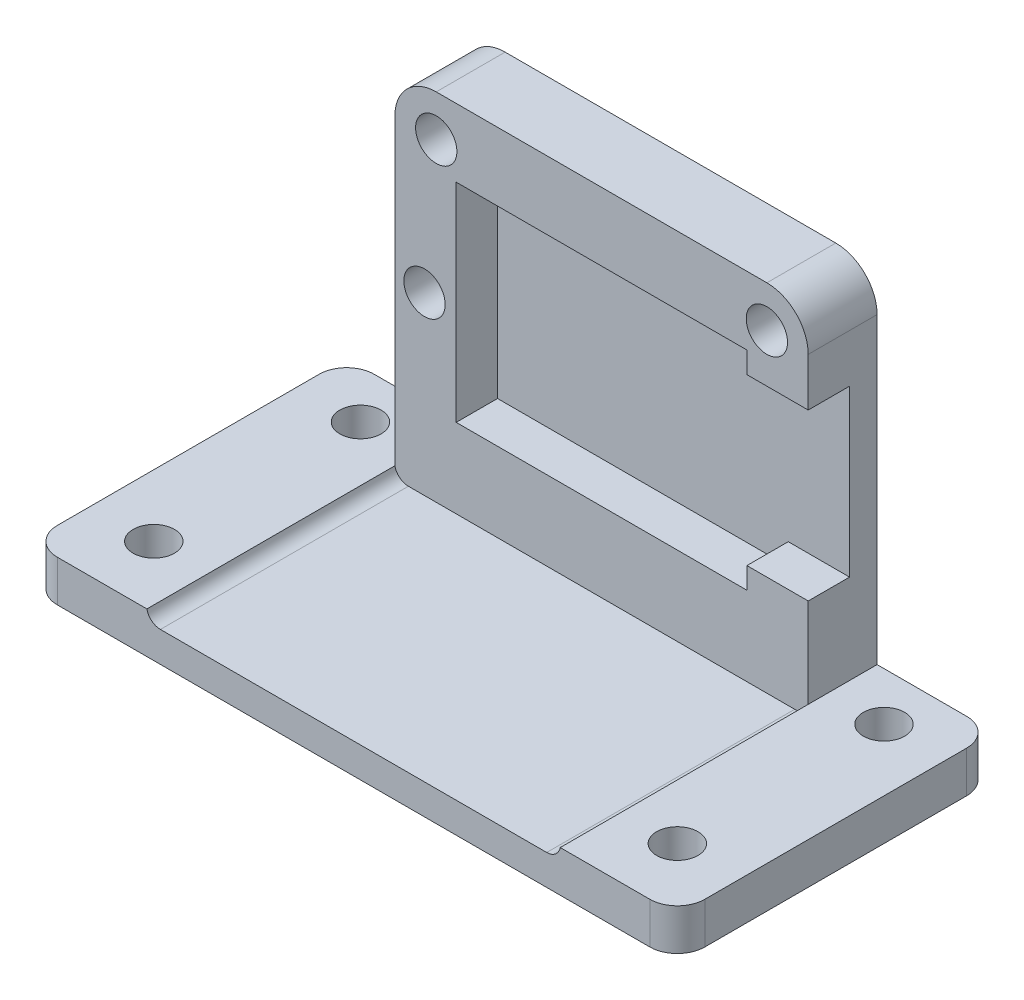
ISO-10303-21;
HEADER;
FILE_DESCRIPTION(('STEP AP214'),'2;1');
FILE_NAME('part.step','',(''),(''),'','','');
FILE_SCHEMA(('AUTOMOTIVE_DESIGN { 1 0 10303 214 1 1 1 1 }'));
ENDSEC;
DATA;
#1=APPLICATION_CONTEXT('core data for automotive mechanical design processes');
#2=APPLICATION_PROTOCOL_DEFINITION('international standard','automotive_design',2000,#1);
#3=PRODUCT_CONTEXT('',#1,'mechanical');
#4=PRODUCT('Part','Part','',(#3));
#5=PRODUCT_RELATED_PRODUCT_CATEGORY('part','',(#4));
#6=PRODUCT_DEFINITION_FORMATION('','',#4);
#7=PRODUCT_DEFINITION_CONTEXT('part definition',#1,'design');
#8=PRODUCT_DEFINITION('design','',#6,#7);
#9=PRODUCT_DEFINITION_SHAPE('','',#8);
#10=(LENGTH_UNIT() NAMED_UNIT(*) SI_UNIT(.MILLI.,.METRE.));
#11=(NAMED_UNIT(*) PLANE_ANGLE_UNIT() SI_UNIT($,.RADIAN.));
#12=(NAMED_UNIT(*) SI_UNIT($,.STERADIAN.) SOLID_ANGLE_UNIT());
#13=UNCERTAINTY_MEASURE_WITH_UNIT(LENGTH_MEASURE(1.E-05),#10,'distance_accuracy_value','');
#14=(GEOMETRIC_REPRESENTATION_CONTEXT(3) GLOBAL_UNCERTAINTY_ASSIGNED_CONTEXT((#13)) GLOBAL_UNIT_ASSIGNED_CONTEXT((#10,
#11,#12)) REPRESENTATION_CONTEXT('',''));
#15=CARTESIAN_POINT('',(0.,0.,0.));
#16=DIRECTION('',(0.,0.,1.));
#17=DIRECTION('',(1.,0.,0.));
#18=AXIS2_PLACEMENT_3D('',#15,#16,#17);
#19=CARTESIAN_POINT('',(0.,-12.5,0.));
#20=DIRECTION('',(0.,1.,0.));
#21=DIRECTION('',(-1.,0.,0.));
#22=AXIS2_PLACEMENT_3D('',#19,#20,#21);
#23=PLANE('',#22);
#24=DIRECTION('',(0.,0.,1.));
#25=VECTOR('',#24,1.);
#26=CARTESIAN_POINT('',(-15.,-12.5,-25.0106647710443));
#27=LINE('',#26,#25);
#28=CARTESIAN_POINT('',(-15.,-12.5,5.));
#29=VERTEX_POINT('',#28);
#30=CARTESIAN_POINT('',(-15.,-12.5,23.));
#31=VERTEX_POINT('',#30);
#32=EDGE_CURVE('E221',#29,#31,#27,.T.);
#33=ORIENTED_EDGE('',*,*,#32,.F.);
#34=DIRECTION('',(0.,0.,-1.));
#35=VECTOR('',#34,1.);
#36=CARTESIAN_POINT('',(-15.,-12.5,5.));
#37=LINE('',#36,#35);
#38=CARTESIAN_POINT('',(-15.,-12.5,0.));
#39=VERTEX_POINT('',#38);
#40=EDGE_CURVE('E327',#29,#39,#37,.T.);
#41=ORIENTED_EDGE('',*,*,#40,.T.);
#42=DIRECTION('',(1.,0.,0.));
#43=VECTOR('',#42,1.);
#44=CARTESIAN_POINT('',(-23.5,-12.5,0.));
#45=LINE('',#44,#43);
#46=CARTESIAN_POINT('',(-21.5,-12.5,0.));
#47=VERTEX_POINT('',#46);
#48=EDGE_CURVE('E584',#47,#39,#45,.T.);
#49=ORIENTED_EDGE('',*,*,#48,.F.);
#50=CARTESIAN_POINT('',(-21.5,-12.5,2.));
#51=DIRECTION('',(0.,1.,0.));
#52=DIRECTION('',(-1.,0.,0.));
#53=AXIS2_PLACEMENT_3D('',#50,#51,#52);
#54=CIRCLE('',#53,2.);
#55=CARTESIAN_POINT('',(-23.5,-12.5,2.));
#56=VERTEX_POINT('',#55);
#57=EDGE_CURVE('E363',#47,#56,#54,.T.);
#58=ORIENTED_EDGE('',*,*,#57,.T.);
#59=DIRECTION('',(0.,0.,-1.));
#60=VECTOR('',#59,1.);
#61=CARTESIAN_POINT('',(-23.5,-12.5,0.));
#62=LINE('',#61,#60);
#63=CARTESIAN_POINT('',(-23.5,-12.5,21.));
#64=VERTEX_POINT('',#63);
#65=EDGE_CURVE('E569',#64,#56,#62,.T.);
#66=ORIENTED_EDGE('',*,*,#65,.F.);
#67=CARTESIAN_POINT('',(-21.5,-12.5,21.));
#68=DIRECTION('',(0.,1.,0.));
#69=DIRECTION('',(-1.,0.,0.));
#70=AXIS2_PLACEMENT_3D('',#67,#68,#69);
#71=CIRCLE('',#70,2.);
#72=CARTESIAN_POINT('',(-21.5,-12.5,23.));
#73=VERTEX_POINT('',#72);
#74=EDGE_CURVE('E360',#64,#73,#71,.T.);
#75=ORIENTED_EDGE('',*,*,#74,.T.);
#76=DIRECTION('',(-1.,0.,0.));
#77=VECTOR('',#76,1.);
#78=CARTESIAN_POINT('',(-23.5,-12.5,23.));
#79=LINE('',#78,#77);
#80=EDGE_CURVE('E230',#31,#73,#79,.T.);
#81=ORIENTED_EDGE('',*,*,#80,.F.);
#82=EDGE_LOOP('',(#33,#41,#49,#58,#66,#75,#81));
#83=FACE_BOUND('',#82,.T.);
#84=CARTESIAN_POINT('',(-19.,-12.5,3.5));
#85=DIRECTION('',(0.,1.,0.));
#86=DIRECTION('',(-1.,0.,0.));
#87=AXIS2_PLACEMENT_3D('',#84,#85,#86);
#88=CIRCLE('',#87,1.5);
#89=CARTESIAN_POINT('',(-20.5,-12.5,3.5));
#90=VERTEX_POINT('',#89);
#91=EDGE_CURVE('E605',#90,#90,#88,.T.);
#92=ORIENTED_EDGE('',*,*,#91,.F.);
#93=EDGE_LOOP('',(#92));
#94=FACE_BOUND('',#93,.T.);
#95=CARTESIAN_POINT('',(-19.,-12.5,18.5));
#96=DIRECTION('',(0.,1.,0.));
#97=DIRECTION('',(-1.,0.,0.));
#98=AXIS2_PLACEMENT_3D('',#95,#96,#97);
#99=CIRCLE('',#98,1.5);
#100=CARTESIAN_POINT('',(-20.5,-12.5,18.5));
#101=VERTEX_POINT('',#100);
#102=EDGE_CURVE('E609',#101,#101,#99,.T.);
#103=ORIENTED_EDGE('',*,*,#102,.F.);
#104=EDGE_LOOP('',(#103));
#105=FACE_BOUND('',#104,.T.);
#106=ADVANCED_FACE('F41',(#83,#94,#105),#23,.T.);
#107=CARTESIAN_POINT('',(10.55,-7.55,2.));
#108=DIRECTION('',(1.,0.,0.));
#109=DIRECTION('',(0.,0.,-1.));
#110=AXIS2_PLACEMENT_3D('',#107,#108,#109);
#111=PLANE('',#110);
#112=DIRECTION('',(0.,1.,0.));
#113=VECTOR('',#112,1.);
#114=CARTESIAN_POINT('',(10.55,-7.55,2.));
#115=LINE('',#114,#113);
#116=CARTESIAN_POINT('',(10.55,6.,2.));
#117=VERTEX_POINT('',#116);
#118=CARTESIAN_POINT('',(10.55,7.55,2.));
#119=VERTEX_POINT('',#118);
#120=EDGE_CURVE('E280',#117,#119,#115,.T.);
#121=ORIENTED_EDGE('',*,*,#120,.F.);
#122=DIRECTION('',(0.,0.,1.));
#123=VECTOR('',#122,1.);
#124=CARTESIAN_POINT('',(10.55,6.,-10.7985350724214));
#125=LINE('',#124,#123);
#126=CARTESIAN_POINT('',(10.55,6.,5.));
#127=VERTEX_POINT('',#126);
#128=EDGE_CURVE('E256',#117,#127,#125,.T.);
#129=ORIENTED_EDGE('',*,*,#128,.T.);
#130=DIRECTION('',(0.,1.,0.));
#131=VECTOR('',#130,1.);
#132=CARTESIAN_POINT('',(10.55,-7.55,5.));
#133=LINE('',#132,#131);
#134=CARTESIAN_POINT('',(10.55,7.55,5.));
#135=VERTEX_POINT('',#134);
#136=EDGE_CURVE('E292',#127,#135,#133,.T.);
#137=ORIENTED_EDGE('',*,*,#136,.T.);
#138=DIRECTION('',(0.,0.,1.));
#139=VECTOR('',#138,1.);
#140=CARTESIAN_POINT('',(10.55,7.55,2.));
#141=LINE('',#140,#139);
#142=EDGE_CURVE('E301',#119,#135,#141,.T.);
#143=ORIENTED_EDGE('',*,*,#142,.F.);
#144=EDGE_LOOP('',(#121,#129,#137,#143));
#145=FACE_BOUND('',#144,.T.);
#146=ADVANCED_FACE('F437',(#145),#111,.F.);
#147=CARTESIAN_POINT('',(-15.,-12.5,5.));
#148=DIRECTION('',(1.,0.,0.));
#149=DIRECTION('',(0.,0.,-1.));
#150=AXIS2_PLACEMENT_3D('',#147,#148,#149);
#151=PLANE('',#150);
#152=DIRECTION('',(0.,-1.,0.));
#153=VECTOR('',#152,1.);
#154=CARTESIAN_POINT('',(-15.,-12.5,5.));
#155=LINE('',#154,#153);
#156=CARTESIAN_POINT('',(-15.,9.50000000000001,5.));
#157=VERTEX_POINT('',#156);
#158=EDGE_CURVE('E308',#157,#29,#155,.T.);
#159=ORIENTED_EDGE('',*,*,#158,.F.);
#160=DIRECTION('',(0.,0.,-1.));
#161=VECTOR('',#160,1.);
#162=CARTESIAN_POINT('',(-15.,9.50000000000001,5.));
#163=LINE('',#162,#161);
#164=CARTESIAN_POINT('',(-15.,9.50000000000001,0.));
#165=VERTEX_POINT('',#164);
#166=EDGE_CURVE('E345',#157,#165,#163,.T.);
#167=ORIENTED_EDGE('',*,*,#166,.T.);
#168=DIRECTION('',(0.,-1.,0.));
#169=VECTOR('',#168,1.);
#170=CARTESIAN_POINT('',(-15.,-12.5,0.));
#171=LINE('',#170,#169);
#172=EDGE_CURVE('E300',#165,#39,#171,.T.);
#173=ORIENTED_EDGE('',*,*,#172,.T.);
#174=ORIENTED_EDGE('',*,*,#40,.F.);
#175=EDGE_LOOP('',(#159,#167,#173,#174));
#176=FACE_BOUND('',#175,.T.);
#177=ADVANCED_FACE('F460',(#176),#151,.F.);
#178=CARTESIAN_POINT('',(15.,-12.5,5.));
#179=DIRECTION('',(-1.,0.,0.));
#180=DIRECTION('',(0.,0.,1.));
#181=AXIS2_PLACEMENT_3D('',#178,#179,#180);
#182=PLANE('',#181);
#183=DIRECTION('',(0.,1.,0.));
#184=VECTOR('',#183,1.);
#185=CARTESIAN_POINT('',(15.,-12.5,0.));
#186=LINE('',#185,#184);
#187=CARTESIAN_POINT('',(15.,-12.5,0.));
#188=VERTEX_POINT('',#187);
#189=CARTESIAN_POINT('',(15.,9.50000000000001,0.));
#190=VERTEX_POINT('',#189);
#191=EDGE_CURVE('E321',#188,#190,#186,.T.);
#192=ORIENTED_EDGE('',*,*,#191,.T.);
#193=DIRECTION('',(0.,0.,-1.));
#194=VECTOR('',#193,1.);
#195=CARTESIAN_POINT('',(15.,9.50000000000001,5.));
#196=LINE('',#195,#194);
#197=CARTESIAN_POINT('',(15.,9.50000000000001,5.));
#198=VERTEX_POINT('',#197);
#199=EDGE_CURVE('E339',#190,#198,#196,.F.);
#200=ORIENTED_EDGE('',*,*,#199,.T.);
#201=DIRECTION('',(0.,1.,0.));
#202=VECTOR('',#201,1.);
#203=CARTESIAN_POINT('',(15.,-12.5,5.));
#204=LINE('',#203,#202);
#205=CARTESIAN_POINT('',(15.,6.,5.));
#206=VERTEX_POINT('',#205);
#207=EDGE_CURVE('E311',#206,#198,#204,.T.);
#208=ORIENTED_EDGE('',*,*,#207,.F.);
#209=DIRECTION('',(0.,0.,1.));
#210=VECTOR('',#209,1.);
#211=CARTESIAN_POINT('',(15.,6.,-10.7985350724214));
#212=LINE('',#211,#210);
#213=CARTESIAN_POINT('',(15.,6.,2.));
#214=VERTEX_POINT('',#213);
#215=EDGE_CURVE('E265',#214,#206,#212,.T.);
#216=ORIENTED_EDGE('',*,*,#215,.F.);
#217=DIRECTION('',(0.,-1.,0.));
#218=VECTOR('',#217,1.);
#219=CARTESIAN_POINT('',(15.,-6.,2.));
#220=LINE('',#219,#218);
#221=CARTESIAN_POINT('',(15.,-6.,2.));
#222=VERTEX_POINT('',#221);
#223=EDGE_CURVE('E252',#214,#222,#220,.T.);
#224=ORIENTED_EDGE('',*,*,#223,.T.);
#225=DIRECTION('',(0.,0.,1.));
#226=VECTOR('',#225,1.);
#227=CARTESIAN_POINT('',(15.,-6.,-10.7985350724214));
#228=LINE('',#227,#226);
#229=CARTESIAN_POINT('',(15.,-6.,5.));
#230=VERTEX_POINT('',#229);
#231=EDGE_CURVE('E267',#222,#230,#228,.T.);
#232=ORIENTED_EDGE('',*,*,#231,.T.);
#233=CARTESIAN_POINT('',(15.,-12.5,5.));
#234=VERTEX_POINT('',#233);
#235=EDGE_CURVE('E313',#234,#230,#204,.T.);
#236=ORIENTED_EDGE('',*,*,#235,.F.);
#237=DIRECTION('',(0.,0.,-1.));
#238=VECTOR('',#237,1.);
#239=CARTESIAN_POINT('',(15.,-12.5,5.));
#240=LINE('',#239,#238);
#241=EDGE_CURVE('E220',#234,#188,#240,.T.);
#242=ORIENTED_EDGE('',*,*,#241,.T.);
#243=EDGE_LOOP('',(#192,#200,#208,#216,#224,#232,#236,#242));
#244=FACE_BOUND('',#243,.T.);
#245=ADVANCED_FACE('F403',(#244),#182,.F.);
#246=CARTESIAN_POINT('',(15.,12.5,5.));
#247=DIRECTION('',(0.,-1.,0.));
#248=DIRECTION('',(1.,0.,0.));
#249=AXIS2_PLACEMENT_3D('',#246,#247,#248);
#250=PLANE('',#249);
#251=DIRECTION('',(-1.,0.,0.));
#252=VECTOR('',#251,1.);
#253=CARTESIAN_POINT('',(15.,12.5,5.));
#254=LINE('',#253,#252);
#255=CARTESIAN_POINT('',(12.,12.5,5.));
#256=VERTEX_POINT('',#255);
#257=CARTESIAN_POINT('',(-12.,12.5,5.));
#258=VERTEX_POINT('',#257);
#259=EDGE_CURVE('E316',#256,#258,#254,.T.);
#260=ORIENTED_EDGE('',*,*,#259,.F.);
#261=DIRECTION('',(0.,0.,-1.));
#262=VECTOR('',#261,1.);
#263=CARTESIAN_POINT('',(12.,12.5,5.));
#264=LINE('',#263,#262);
#265=CARTESIAN_POINT('',(12.,12.5,0.));
#266=VERTEX_POINT('',#265);
#267=EDGE_CURVE('E332',#256,#266,#264,.T.);
#268=ORIENTED_EDGE('',*,*,#267,.T.);
#269=DIRECTION('',(-1.,0.,0.));
#270=VECTOR('',#269,1.);
#271=CARTESIAN_POINT('',(15.,12.5,0.));
#272=LINE('',#271,#270);
#273=CARTESIAN_POINT('',(-12.,12.5,0.));
#274=VERTEX_POINT('',#273);
#275=EDGE_CURVE('E312',#266,#274,#272,.T.);
#276=ORIENTED_EDGE('',*,*,#275,.T.);
#277=DIRECTION('',(0.,0.,-1.));
#278=VECTOR('',#277,1.);
#279=CARTESIAN_POINT('',(-12.,12.5,5.));
#280=LINE('',#279,#278);
#281=EDGE_CURVE('E330',#274,#258,#280,.F.);
#282=ORIENTED_EDGE('',*,*,#281,.T.);
#283=EDGE_LOOP('',(#260,#268,#276,#282));
#284=FACE_BOUND('',#283,.T.);
#285=ADVANCED_FACE('F448',(#284),#250,.F.);
#286=CARTESIAN_POINT('',(0.,0.,5.));
#287=DIRECTION('',(0.,0.,1.));
#288=DIRECTION('',(1.,0.,0.));
#289=AXIS2_PLACEMENT_3D('',#286,#287,#288);
#290=PLANE('',#289);
#291=CARTESIAN_POINT('',(12.,9.50000000000001,5.));
#292=DIRECTION('',(0.,0.,1.));
#293=DIRECTION('',(1.,0.,0.));
#294=AXIS2_PLACEMENT_3D('',#291,#292,#293);
#295=CIRCLE('',#294,1.5);
#296=CARTESIAN_POINT('',(13.5,9.50000000000001,5.));
#297=VERTEX_POINT('',#296);
#298=EDGE_CURVE('E248',#297,#297,#295,.T.);
#299=ORIENTED_EDGE('',*,*,#298,.F.);
#300=EDGE_LOOP('',(#299));
#301=FACE_BOUND('',#300,.T.);
#302=CARTESIAN_POINT('',(-12.,9.50000000000001,5.));
#303=DIRECTION('',(0.,0.,1.));
#304=DIRECTION('',(1.,0.,0.));
#305=AXIS2_PLACEMENT_3D('',#302,#303,#304);
#306=CIRCLE('',#305,1.5);
#307=CARTESIAN_POINT('',(-10.5,9.50000000000001,5.));
#308=VERTEX_POINT('',#307);
#309=EDGE_CURVE('E244',#308,#308,#306,.T.);
#310=ORIENTED_EDGE('',*,*,#309,.F.);
#311=EDGE_LOOP('',(#310));
#312=FACE_BOUND('',#311,.T.);
#313=CARTESIAN_POINT('',(-12.85,-0.550000000000003,5.));
#314=DIRECTION('',(0.,0.,1.));
#315=DIRECTION('',(1.,0.,0.));
#316=AXIS2_PLACEMENT_3D('',#313,#314,#315);
#317=CIRCLE('',#316,1.5);
#318=CARTESIAN_POINT('',(-11.35,-0.550000000000003,5.));
#319=VERTEX_POINT('',#318);
#320=EDGE_CURVE('E239',#319,#319,#317,.T.);
#321=ORIENTED_EDGE('',*,*,#320,.F.);
#322=EDGE_LOOP('',(#321));
#323=FACE_BOUND('',#322,.T.);
#324=DIRECTION('',(-1.,0.,0.));
#325=VECTOR('',#324,1.);
#326=CARTESIAN_POINT('',(-15.,-13.3,5.));
#327=LINE('',#326,#325);
#328=CARTESIAN_POINT('',(14.0202041028867,-13.3,5.));
#329=VERTEX_POINT('',#328);
#330=CARTESIAN_POINT('',(-14.0202041028867,-13.3,5.));
#331=VERTEX_POINT('',#330);
#332=EDGE_CURVE('E401',#329,#331,#327,.T.);
#333=ORIENTED_EDGE('',*,*,#332,.F.);
#334=CARTESIAN_POINT('',(14.0202041028867,-12.3,5.));
#335=DIRECTION('',(0.,0.,1.));
#336=DIRECTION('',(1.,0.,0.));
#337=AXIS2_PLACEMENT_3D('',#334,#335,#336);
#338=CIRCLE('',#337,1.);
#339=EDGE_CURVE('E212',#329,#234,#338,.T.);
#340=ORIENTED_EDGE('',*,*,#339,.T.);
#341=ORIENTED_EDGE('',*,*,#235,.T.);
#342=DIRECTION('',(1.,0.,0.));
#343=VECTOR('',#342,1.);
#344=CARTESIAN_POINT('',(15.,-6.,5.));
#345=LINE('',#344,#343);
#346=CARTESIAN_POINT('',(10.55,-6.,5.));
#347=VERTEX_POINT('',#346);
#348=EDGE_CURVE('E251',#347,#230,#345,.T.);
#349=ORIENTED_EDGE('',*,*,#348,.F.);
#350=CARTESIAN_POINT('',(10.55,-7.55,5.));
#351=VERTEX_POINT('',#350);
#352=EDGE_CURVE('E293',#351,#347,#133,.T.);
#353=ORIENTED_EDGE('',*,*,#352,.F.);
#354=DIRECTION('',(1.,0.,0.));
#355=VECTOR('',#354,1.);
#356=CARTESIAN_POINT('',(10.55,-7.55,5.));
#357=LINE('',#356,#355);
#358=CARTESIAN_POINT('',(-10.55,-7.55,5.));
#359=VERTEX_POINT('',#358);
#360=EDGE_CURVE('E289',#359,#351,#357,.T.);
#361=ORIENTED_EDGE('',*,*,#360,.F.);
#362=DIRECTION('',(0.,-1.,0.));
#363=VECTOR('',#362,1.);
#364=CARTESIAN_POINT('',(-10.55,-7.55,5.));
#365=LINE('',#364,#363);
#366=CARTESIAN_POINT('',(-10.55,7.55,5.));
#367=VERTEX_POINT('',#366);
#368=EDGE_CURVE('E272',#367,#359,#365,.T.);
#369=ORIENTED_EDGE('',*,*,#368,.F.);
#370=DIRECTION('',(-1.,0.,0.));
#371=VECTOR('',#370,1.);
#372=CARTESIAN_POINT('',(10.55,7.55,5.));
#373=LINE('',#372,#371);
#374=EDGE_CURVE('E277',#135,#367,#373,.T.);
#375=ORIENTED_EDGE('',*,*,#374,.F.);
#376=ORIENTED_EDGE('',*,*,#136,.F.);
#377=DIRECTION('',(-1.,0.,0.));
#378=VECTOR('',#377,1.);
#379=CARTESIAN_POINT('',(15.,6.,5.));
#380=LINE('',#379,#378);
#381=EDGE_CURVE('E260',#206,#127,#380,.T.);
#382=ORIENTED_EDGE('',*,*,#381,.F.);
#383=ORIENTED_EDGE('',*,*,#207,.T.);
#384=CARTESIAN_POINT('',(12.,9.50000000000001,5.));
#385=DIRECTION('',(0.,0.,1.));
#386=DIRECTION('',(1.,0.,0.));
#387=AXIS2_PLACEMENT_3D('',#384,#385,#386);
#388=CIRCLE('',#387,3.);
#389=EDGE_CURVE('E343',#198,#256,#388,.T.);
#390=ORIENTED_EDGE('',*,*,#389,.T.);
#391=ORIENTED_EDGE('',*,*,#259,.T.);
#392=CARTESIAN_POINT('',(-12.,9.50000000000001,5.));
#393=DIRECTION('',(0.,0.,1.));
#394=DIRECTION('',(1.,0.,0.));
#395=AXIS2_PLACEMENT_3D('',#392,#393,#394);
#396=CIRCLE('',#395,3.);
#397=EDGE_CURVE('E341',#258,#157,#396,.T.);
#398=ORIENTED_EDGE('',*,*,#397,.T.);
#399=ORIENTED_EDGE('',*,*,#158,.T.);
#400=CARTESIAN_POINT('',(-14.0202041028867,-12.3,5.));
#401=DIRECTION('',(0.,0.,1.));
#402=DIRECTION('',(1.,0.,0.));
#403=AXIS2_PLACEMENT_3D('',#400,#401,#402);
#404=CIRCLE('',#403,1.);
#405=EDGE_CURVE('E393',#29,#331,#404,.T.);
#406=ORIENTED_EDGE('',*,*,#405,.T.);
#407=EDGE_LOOP('',(#333,#340,#341,#349,#353,#361,#369,#375,#376,#382,#383,#390,#391,#398,#399,#406));
#408=FACE_BOUND('',#407,.T.);
#409=ADVANCED_FACE('F398',(#301,#312,#323,#408),#290,.T.);
#410=CARTESIAN_POINT('',(0.,0.,0.));
#411=DIRECTION('',(0.,0.,1.));
#412=DIRECTION('',(1.,0.,0.));
#413=AXIS2_PLACEMENT_3D('',#410,#411,#412);
#414=PLANE('',#413);
#415=CARTESIAN_POINT('',(12.,9.50000000000001,0.));
#416=DIRECTION('',(0.,0.,1.));
#417=DIRECTION('',(1.,0.,0.));
#418=AXIS2_PLACEMENT_3D('',#415,#416,#417);
#419=CIRCLE('',#418,1.5);
#420=CARTESIAN_POINT('',(13.5,9.50000000000001,0.));
#421=VERTEX_POINT('',#420);
#422=EDGE_CURVE('E247',#421,#421,#419,.T.);
#423=ORIENTED_EDGE('',*,*,#422,.T.);
#424=EDGE_LOOP('',(#423));
#425=FACE_BOUND('',#424,.T.);
#426=CARTESIAN_POINT('',(-12.,9.50000000000001,0.));
#427=DIRECTION('',(0.,0.,1.));
#428=DIRECTION('',(1.,0.,0.));
#429=AXIS2_PLACEMENT_3D('',#426,#427,#428);
#430=CIRCLE('',#429,1.5);
#431=CARTESIAN_POINT('',(-10.5,9.50000000000001,0.));
#432=VERTEX_POINT('',#431);
#433=EDGE_CURVE('E242',#432,#432,#430,.T.);
#434=ORIENTED_EDGE('',*,*,#433,.T.);
#435=EDGE_LOOP('',(#434));
#436=FACE_BOUND('',#435,.T.);
#437=CARTESIAN_POINT('',(-12.85,-0.550000000000003,0.));
#438=DIRECTION('',(0.,0.,1.));
#439=DIRECTION('',(1.,0.,0.));
#440=AXIS2_PLACEMENT_3D('',#437,#438,#439);
#441=CIRCLE('',#440,1.5);
#442=CARTESIAN_POINT('',(-11.35,-0.550000000000003,0.));
#443=VERTEX_POINT('',#442);
#444=EDGE_CURVE('E243',#443,#443,#441,.T.);
#445=ORIENTED_EDGE('',*,*,#444,.T.);
#446=EDGE_LOOP('',(#445));
#447=FACE_BOUND('',#446,.T.);
#448=CARTESIAN_POINT('',(21.5,-12.5,0.));
#449=VERTEX_POINT('',#448);
#450=EDGE_CURVE('E582',#188,#449,#45,.T.);
#451=ORIENTED_EDGE('',*,*,#450,.T.);
#452=DIRECTION('',(0.,1.,0.));
#453=VECTOR('',#452,1.);
#454=CARTESIAN_POINT('',(21.5,0.,0.));
#455=LINE('',#454,#453);
#456=CARTESIAN_POINT('',(21.5,-15.5,0.));
#457=VERTEX_POINT('',#456);
#458=EDGE_CURVE('E372',#449,#457,#455,.F.);
#459=ORIENTED_EDGE('',*,*,#458,.T.);
#460=DIRECTION('',(1.,0.,0.));
#461=VECTOR('',#460,1.);
#462=CARTESIAN_POINT('',(-23.5,-15.5,0.));
#463=LINE('',#462,#461);
#464=CARTESIAN_POINT('',(-21.5,-15.5,0.));
#465=VERTEX_POINT('',#464);
#466=EDGE_CURVE('E233',#465,#457,#463,.T.);
#467=ORIENTED_EDGE('',*,*,#466,.F.);
#468=DIRECTION('',(0.,1.,0.));
#469=VECTOR('',#468,1.);
#470=CARTESIAN_POINT('',(-21.5,0.,0.));
#471=LINE('',#470,#469);
#472=EDGE_CURVE('E369',#465,#47,#471,.T.);
#473=ORIENTED_EDGE('',*,*,#472,.T.);
#474=ORIENTED_EDGE('',*,*,#48,.T.);
#475=ORIENTED_EDGE('',*,*,#172,.F.);
#476=CARTESIAN_POINT('',(-12.,9.50000000000001,0.));
#477=DIRECTION('',(0.,0.,1.));
#478=DIRECTION('',(1.,0.,0.));
#479=AXIS2_PLACEMENT_3D('',#476,#477,#478);
#480=CIRCLE('',#479,3.);
#481=EDGE_CURVE('E335',#165,#274,#480,.F.);
#482=ORIENTED_EDGE('',*,*,#481,.T.);
#483=ORIENTED_EDGE('',*,*,#275,.F.);
#484=CARTESIAN_POINT('',(12.,9.50000000000001,0.));
#485=DIRECTION('',(0.,0.,1.));
#486=DIRECTION('',(1.,0.,0.));
#487=AXIS2_PLACEMENT_3D('',#484,#485,#486);
#488=CIRCLE('',#487,3.);
#489=EDGE_CURVE('E337',#266,#190,#488,.F.);
#490=ORIENTED_EDGE('',*,*,#489,.T.);
#491=ORIENTED_EDGE('',*,*,#191,.F.);
#492=EDGE_LOOP('',(#451,#459,#467,#473,#474,#475,#482,#483,#490,#491));
#493=FACE_BOUND('',#492,.T.);
#494=ADVANCED_FACE('F452',(#425,#436,#447,#493),#414,.F.);
#495=CARTESIAN_POINT('',(-10.55,-7.55,2.));
#496=DIRECTION('',(-1.,0.,0.));
#497=DIRECTION('',(0.,0.,1.));
#498=AXIS2_PLACEMENT_3D('',#495,#496,#497);
#499=PLANE('',#498);
#500=ORIENTED_EDGE('',*,*,#368,.T.);
#501=DIRECTION('',(0.,0.,1.));
#502=VECTOR('',#501,1.);
#503=CARTESIAN_POINT('',(-10.55,-7.55,2.));
#504=LINE('',#503,#502);
#505=CARTESIAN_POINT('',(-10.55,-7.55,2.));
#506=VERTEX_POINT('',#505);
#507=EDGE_CURVE('E287',#506,#359,#504,.T.);
#508=ORIENTED_EDGE('',*,*,#507,.F.);
#509=DIRECTION('',(0.,-1.,0.));
#510=VECTOR('',#509,1.);
#511=CARTESIAN_POINT('',(-10.55,-7.55,2.));
#512=LINE('',#511,#510);
#513=CARTESIAN_POINT('',(-10.55,7.55,2.));
#514=VERTEX_POINT('',#513);
#515=EDGE_CURVE('E273',#514,#506,#512,.T.);
#516=ORIENTED_EDGE('',*,*,#515,.F.);
#517=DIRECTION('',(0.,0.,1.));
#518=VECTOR('',#517,1.);
#519=CARTESIAN_POINT('',(-10.55,7.55,2.));
#520=LINE('',#519,#518);
#521=EDGE_CURVE('E298',#514,#367,#520,.T.);
#522=ORIENTED_EDGE('',*,*,#521,.T.);
#523=EDGE_LOOP('',(#500,#508,#516,#522));
#524=FACE_BOUND('',#523,.T.);
#525=ADVANCED_FACE('F426',(#524),#499,.F.);
#526=CARTESIAN_POINT('',(10.55,7.55,2.));
#527=DIRECTION('',(0.,1.,0.));
#528=DIRECTION('',(-1.,0.,0.));
#529=AXIS2_PLACEMENT_3D('',#526,#527,#528);
#530=PLANE('',#529);
#531=ORIENTED_EDGE('',*,*,#374,.T.);
#532=ORIENTED_EDGE('',*,*,#521,.F.);
#533=DIRECTION('',(-1.,0.,0.));
#534=VECTOR('',#533,1.);
#535=CARTESIAN_POINT('',(10.55,7.55,2.));
#536=LINE('',#535,#534);
#537=EDGE_CURVE('E284',#119,#514,#536,.T.);
#538=ORIENTED_EDGE('',*,*,#537,.F.);
#539=ORIENTED_EDGE('',*,*,#142,.T.);
#540=EDGE_LOOP('',(#531,#532,#538,#539));
#541=FACE_BOUND('',#540,.T.);
#542=ADVANCED_FACE('F429',(#541),#530,.F.);
#543=ORIENTED_EDGE('',*,*,#352,.T.);
#544=DIRECTION('',(0.,0.,1.));
#545=VECTOR('',#544,1.);
#546=CARTESIAN_POINT('',(10.55,-6.,-10.7985350724214));
#547=LINE('',#546,#545);
#548=CARTESIAN_POINT('',(10.55,-6.,2.));
#549=VERTEX_POINT('',#548);
#550=EDGE_CURVE('E262',#549,#347,#547,.T.);
#551=ORIENTED_EDGE('',*,*,#550,.F.);
#552=CARTESIAN_POINT('',(10.55,-7.55,2.));
#553=VERTEX_POINT('',#552);
#554=EDGE_CURVE('E281',#553,#549,#115,.T.);
#555=ORIENTED_EDGE('',*,*,#554,.F.);
#556=DIRECTION('',(0.,0.,1.));
#557=VECTOR('',#556,1.);
#558=CARTESIAN_POINT('',(10.55,-7.55,2.));
#559=LINE('',#558,#557);
#560=EDGE_CURVE('E304',#553,#351,#559,.T.);
#561=ORIENTED_EDGE('',*,*,#560,.T.);
#562=EDGE_LOOP('',(#543,#551,#555,#561));
#563=FACE_BOUND('',#562,.T.);
#564=ADVANCED_FACE('F417',(#563),#111,.F.);
#565=CARTESIAN_POINT('',(10.55,-7.55,2.));
#566=DIRECTION('',(0.,-1.,0.));
#567=DIRECTION('',(1.,0.,0.));
#568=AXIS2_PLACEMENT_3D('',#565,#566,#567);
#569=PLANE('',#568);
#570=ORIENTED_EDGE('',*,*,#360,.T.);
#571=ORIENTED_EDGE('',*,*,#560,.F.);
#572=DIRECTION('',(1.,0.,0.));
#573=VECTOR('',#572,1.);
#574=CARTESIAN_POINT('',(10.55,-7.55,2.));
#575=LINE('',#574,#573);
#576=EDGE_CURVE('E276',#506,#553,#575,.T.);
#577=ORIENTED_EDGE('',*,*,#576,.F.);
#578=ORIENTED_EDGE('',*,*,#507,.T.);
#579=EDGE_LOOP('',(#570,#571,#577,#578));
#580=FACE_BOUND('',#579,.T.);
#581=ADVANCED_FACE('F423',(#580),#569,.F.);
#582=CARTESIAN_POINT('',(0.,0.,2.));
#583=DIRECTION('',(0.,0.,1.));
#584=DIRECTION('',(1.,0.,0.));
#585=AXIS2_PLACEMENT_3D('',#582,#583,#584);
#586=PLANE('',#585);
#587=ORIENTED_EDGE('',*,*,#515,.T.);
#588=ORIENTED_EDGE('',*,*,#576,.T.);
#589=ORIENTED_EDGE('',*,*,#554,.T.);
#590=DIRECTION('',(-1.,0.,0.));
#591=VECTOR('',#590,1.);
#592=CARTESIAN_POINT('',(15.,-6.,2.));
#593=LINE('',#592,#591);
#594=EDGE_CURVE('E258',#222,#549,#593,.T.);
#595=ORIENTED_EDGE('',*,*,#594,.F.);
#596=ORIENTED_EDGE('',*,*,#223,.F.);
#597=DIRECTION('',(1.,0.,0.));
#598=VECTOR('',#597,1.);
#599=CARTESIAN_POINT('',(15.,6.,2.));
#600=LINE('',#599,#598);
#601=EDGE_CURVE('E255',#117,#214,#600,.T.);
#602=ORIENTED_EDGE('',*,*,#601,.F.);
#603=ORIENTED_EDGE('',*,*,#120,.T.);
#604=ORIENTED_EDGE('',*,*,#537,.T.);
#605=EDGE_LOOP('',(#587,#588,#589,#595,#596,#602,#603,#604));
#606=FACE_BOUND('',#605,.T.);
#607=ADVANCED_FACE('F412',(#606),#586,.T.);
#608=CARTESIAN_POINT('',(15.,6.,-10.7985350724214));
#609=DIRECTION('',(0.,1.,0.));
#610=DIRECTION('',(-1.,0.,0.));
#611=AXIS2_PLACEMENT_3D('',#608,#609,#610);
#612=PLANE('',#611);
#613=ORIENTED_EDGE('',*,*,#601,.T.);
#614=ORIENTED_EDGE('',*,*,#215,.T.);
#615=ORIENTED_EDGE('',*,*,#381,.T.);
#616=ORIENTED_EDGE('',*,*,#128,.F.);
#617=EDGE_LOOP('',(#613,#614,#615,#616));
#618=FACE_BOUND('',#617,.T.);
#619=ADVANCED_FACE('F439',(#618),#612,.F.);
#620=CARTESIAN_POINT('',(15.,-6.,-10.7985350724214));
#621=DIRECTION('',(0.,-1.,0.));
#622=DIRECTION('',(1.,0.,0.));
#623=AXIS2_PLACEMENT_3D('',#620,#621,#622);
#624=PLANE('',#623);
#625=ORIENTED_EDGE('',*,*,#594,.T.);
#626=ORIENTED_EDGE('',*,*,#550,.T.);
#627=ORIENTED_EDGE('',*,*,#348,.T.);
#628=ORIENTED_EDGE('',*,*,#231,.F.);
#629=EDGE_LOOP('',(#625,#626,#627,#628));
#630=FACE_BOUND('',#629,.T.);
#631=ADVANCED_FACE('F409',(#630),#624,.F.);
#632=CARTESIAN_POINT('',(12.,9.50000000000001,5.));
#633=DIRECTION('',(0.,0.,-1.));
#634=DIRECTION('',(-1.,0.,0.));
#635=AXIS2_PLACEMENT_3D('',#632,#633,#634);
#636=CYLINDRICAL_SURFACE('',#635,3.);
#637=ORIENTED_EDGE('',*,*,#389,.F.);
#638=ORIENTED_EDGE('',*,*,#199,.F.);
#639=ORIENTED_EDGE('',*,*,#489,.F.);
#640=ORIENTED_EDGE('',*,*,#267,.F.);
#641=EDGE_LOOP('',(#637,#638,#639,#640));
#642=FACE_BOUND('',#641,.T.);
#643=ADVANCED_FACE('F445',(#642),#636,.T.);
#644=CARTESIAN_POINT('',(-12.,9.50000000000001,5.));
#645=DIRECTION('',(0.,0.,-1.));
#646=DIRECTION('',(-1.,0.,0.));
#647=AXIS2_PLACEMENT_3D('',#644,#645,#646);
#648=CYLINDRICAL_SURFACE('',#647,3.);
#649=ORIENTED_EDGE('',*,*,#397,.F.);
#650=ORIENTED_EDGE('',*,*,#281,.F.);
#651=ORIENTED_EDGE('',*,*,#481,.F.);
#652=ORIENTED_EDGE('',*,*,#166,.F.);
#653=EDGE_LOOP('',(#649,#650,#651,#652));
#654=FACE_BOUND('',#653,.T.);
#655=ADVANCED_FACE('F457',(#654),#648,.T.);
#656=CARTESIAN_POINT('',(-12.85,-0.550000000000003,-8.));
#657=DIRECTION('',(0.,0.,1.));
#658=DIRECTION('',(1.,0.,0.));
#659=AXIS2_PLACEMENT_3D('',#656,#657,#658);
#660=CYLINDRICAL_SURFACE('',#659,1.5);
#661=ORIENTED_EDGE('',*,*,#320,.T.);
#662=EDGE_LOOP('',(#661));
#663=FACE_BOUND('',#662,.T.);
#664=ORIENTED_EDGE('',*,*,#444,.F.);
#665=EDGE_LOOP('',(#664));
#666=FACE_BOUND('',#665,.T.);
#667=ADVANCED_FACE('F502',(#663,#666),#660,.F.);
#668=CARTESIAN_POINT('',(-12.,9.50000000000001,-8.));
#669=DIRECTION('',(0.,0.,1.));
#670=DIRECTION('',(1.,0.,0.));
#671=AXIS2_PLACEMENT_3D('',#668,#669,#670);
#672=CYLINDRICAL_SURFACE('',#671,1.5);
#673=ORIENTED_EDGE('',*,*,#309,.T.);
#674=EDGE_LOOP('',(#673));
#675=FACE_BOUND('',#674,.T.);
#676=ORIENTED_EDGE('',*,*,#433,.F.);
#677=EDGE_LOOP('',(#676));
#678=FACE_BOUND('',#677,.T.);
#679=ADVANCED_FACE('F495',(#675,#678),#672,.F.);
#680=CARTESIAN_POINT('',(12.,9.50000000000001,-8.));
#681=DIRECTION('',(0.,0.,1.));
#682=DIRECTION('',(1.,0.,0.));
#683=AXIS2_PLACEMENT_3D('',#680,#681,#682);
#684=CYLINDRICAL_SURFACE('',#683,1.5);
#685=ORIENTED_EDGE('',*,*,#298,.T.);
#686=EDGE_LOOP('',(#685));
#687=FACE_BOUND('',#686,.T.);
#688=ORIENTED_EDGE('',*,*,#422,.F.);
#689=EDGE_LOOP('',(#688));
#690=FACE_BOUND('',#689,.T.);
#691=ADVANCED_FACE('F485',(#687,#690),#684,.F.);
#692=DIRECTION('',(0.,0.,1.));
#693=VECTOR('',#692,1.);
#694=CARTESIAN_POINT('',(15.,-12.5,-25.0106647710443));
#695=LINE('',#694,#693);
#696=CARTESIAN_POINT('',(15.,-12.5,23.));
#697=VERTEX_POINT('',#696);
#698=EDGE_CURVE('E210',#234,#697,#695,.T.);
#699=ORIENTED_EDGE('',*,*,#698,.T.);
#700=CARTESIAN_POINT('',(21.5,-12.5,23.));
#701=VERTEX_POINT('',#700);
#702=EDGE_CURVE('E218',#701,#697,#79,.T.);
#703=ORIENTED_EDGE('',*,*,#702,.F.);
#704=CARTESIAN_POINT('',(21.5,-12.5,21.));
#705=DIRECTION('',(0.,1.,0.));
#706=DIRECTION('',(-1.,0.,0.));
#707=AXIS2_PLACEMENT_3D('',#704,#705,#706);
#708=CIRCLE('',#707,2.);
#709=CARTESIAN_POINT('',(23.5,-12.5,21.));
#710=VERTEX_POINT('',#709);
#711=EDGE_CURVE('E365',#701,#710,#708,.T.);
#712=ORIENTED_EDGE('',*,*,#711,.T.);
#713=DIRECTION('',(0.,0.,1.));
#714=VECTOR('',#713,1.);
#715=CARTESIAN_POINT('',(23.5,-12.5,0.));
#716=LINE('',#715,#714);
#717=CARTESIAN_POINT('',(23.5,-12.5,2.));
#718=VERTEX_POINT('',#717);
#719=EDGE_CURVE('E235',#718,#710,#716,.T.);
#720=ORIENTED_EDGE('',*,*,#719,.F.);
#721=CARTESIAN_POINT('',(21.5,-12.5,2.));
#722=DIRECTION('',(0.,1.,0.));
#723=DIRECTION('',(-1.,0.,0.));
#724=AXIS2_PLACEMENT_3D('',#721,#722,#723);
#725=CIRCLE('',#724,2.);
#726=EDGE_CURVE('E367',#718,#449,#725,.T.);
#727=ORIENTED_EDGE('',*,*,#726,.T.);
#728=ORIENTED_EDGE('',*,*,#450,.F.);
#729=ORIENTED_EDGE('',*,*,#241,.F.);
#730=EDGE_LOOP('',(#699,#703,#712,#720,#727,#728,#729));
#731=FACE_BOUND('',#730,.T.);
#732=CARTESIAN_POINT('',(19.,-12.5,3.5));
#733=DIRECTION('',(0.,1.,0.));
#734=DIRECTION('',(-1.,0.,0.));
#735=AXIS2_PLACEMENT_3D('',#732,#733,#734);
#736=CIRCLE('',#735,1.5);
#737=CARTESIAN_POINT('',(17.5,-12.5,3.5));
#738=VERTEX_POINT('',#737);
#739=EDGE_CURVE('E602',#738,#738,#736,.T.);
#740=ORIENTED_EDGE('',*,*,#739,.F.);
#741=EDGE_LOOP('',(#740));
#742=FACE_BOUND('',#741,.T.);
#743=CARTESIAN_POINT('',(19.,-12.5,18.5));
#744=DIRECTION('',(0.,1.,0.));
#745=DIRECTION('',(-1.,0.,0.));
#746=AXIS2_PLACEMENT_3D('',#743,#744,#745);
#747=CIRCLE('',#746,1.5);
#748=CARTESIAN_POINT('',(17.5,-12.5,18.5));
#749=VERTEX_POINT('',#748);
#750=EDGE_CURVE('E596',#749,#749,#747,.T.);
#751=ORIENTED_EDGE('',*,*,#750,.F.);
#752=EDGE_LOOP('',(#751));
#753=FACE_BOUND('',#752,.T.);
#754=ADVANCED_FACE('F216',(#731,#742,#753),#23,.T.);
#755=CARTESIAN_POINT('',(-23.5,-15.5,0.));
#756=DIRECTION('',(1.,0.,0.));
#757=DIRECTION('',(0.,1.,0.));
#758=AXIS2_PLACEMENT_3D('',#755,#756,#757);
#759=PLANE('',#758);
#760=ORIENTED_EDGE('',*,*,#65,.T.);
#761=DIRECTION('',(0.,1.,0.));
#762=VECTOR('',#761,1.);
#763=CARTESIAN_POINT('',(-23.5,-15.5,2.));
#764=LINE('',#763,#762);
#765=CARTESIAN_POINT('',(-23.5,-15.5,2.));
#766=VERTEX_POINT('',#765);
#767=EDGE_CURVE('E388',#56,#766,#764,.F.);
#768=ORIENTED_EDGE('',*,*,#767,.T.);
#769=DIRECTION('',(0.,0.,-1.));
#770=VECTOR('',#769,1.);
#771=CARTESIAN_POINT('',(-23.5,-15.5,0.));
#772=LINE('',#771,#770);
#773=CARTESIAN_POINT('',(-23.5,-15.5,21.));
#774=VERTEX_POINT('',#773);
#775=EDGE_CURVE('E229',#774,#766,#772,.T.);
#776=ORIENTED_EDGE('',*,*,#775,.F.);
#777=DIRECTION('',(0.,1.,0.));
#778=VECTOR('',#777,1.);
#779=CARTESIAN_POINT('',(-23.5,-15.5,21.));
#780=LINE('',#779,#778);
#781=EDGE_CURVE('E385',#774,#64,#780,.T.);
#782=ORIENTED_EDGE('',*,*,#781,.T.);
#783=EDGE_LOOP('',(#760,#768,#776,#782));
#784=FACE_BOUND('',#783,.T.);
#785=ADVANCED_FACE('F484',(#784),#759,.F.);
#786=CARTESIAN_POINT('',(23.5,-15.5,0.));
#787=DIRECTION('',(-1.,0.,0.));
#788=DIRECTION('',(0.,-1.,0.));
#789=AXIS2_PLACEMENT_3D('',#786,#787,#788);
#790=PLANE('',#789);
#791=DIRECTION('',(0.,0.,1.));
#792=VECTOR('',#791,1.);
#793=CARTESIAN_POINT('',(23.5,-15.5,0.));
#794=LINE('',#793,#792);
#795=CARTESIAN_POINT('',(23.5,-15.5,2.));
#796=VERTEX_POINT('',#795);
#797=CARTESIAN_POINT('',(23.5,-15.5,21.));
#798=VERTEX_POINT('',#797);
#799=EDGE_CURVE('E575',#796,#798,#794,.T.);
#800=ORIENTED_EDGE('',*,*,#799,.F.);
#801=DIRECTION('',(0.,1.,0.));
#802=VECTOR('',#801,1.);
#803=CARTESIAN_POINT('',(23.5,-15.5,2.));
#804=LINE('',#803,#802);
#805=EDGE_CURVE('E357',#796,#718,#804,.T.);
#806=ORIENTED_EDGE('',*,*,#805,.T.);
#807=ORIENTED_EDGE('',*,*,#719,.T.);
#808=DIRECTION('',(0.,1.,0.));
#809=VECTOR('',#808,1.);
#810=CARTESIAN_POINT('',(23.5,-15.5,21.));
#811=LINE('',#810,#809);
#812=EDGE_CURVE('E348',#710,#798,#811,.F.);
#813=ORIENTED_EDGE('',*,*,#812,.T.);
#814=EDGE_LOOP('',(#800,#806,#807,#813));
#815=FACE_BOUND('',#814,.T.);
#816=ADVANCED_FACE('F491',(#815),#790,.F.);
#817=CARTESIAN_POINT('',(-23.5,-15.5,23.));
#818=DIRECTION('',(0.,0.,-1.));
#819=DIRECTION('',(-1.,0.,0.));
#820=AXIS2_PLACEMENT_3D('',#817,#818,#819);
#821=PLANE('',#820);
#822=DIRECTION('',(1.,0.,0.));
#823=VECTOR('',#822,1.);
#824=CARTESIAN_POINT('',(-15.,-13.3,23.));
#825=LINE('',#824,#823);
#826=CARTESIAN_POINT('',(-14.0202041028867,-13.3,23.));
#827=VERTEX_POINT('',#826);
#828=CARTESIAN_POINT('',(14.0202041028867,-13.3,23.));
#829=VERTEX_POINT('',#828);
#830=EDGE_CURVE('E222',#827,#829,#825,.T.);
#831=ORIENTED_EDGE('',*,*,#830,.F.);
#832=CARTESIAN_POINT('',(-14.0202041028867,-12.3,23.));
#833=DIRECTION('',(0.,0.,-1.));
#834=DIRECTION('',(-1.,0.,0.));
#835=AXIS2_PLACEMENT_3D('',#832,#833,#834);
#836=CIRCLE('',#835,1.);
#837=EDGE_CURVE('E11',#827,#31,#836,.T.);
#838=ORIENTED_EDGE('',*,*,#837,.T.);
#839=ORIENTED_EDGE('',*,*,#80,.T.);
#840=DIRECTION('',(0.,1.,0.));
#841=VECTOR('',#840,1.);
#842=CARTESIAN_POINT('',(-21.5,-15.5,23.));
#843=LINE('',#842,#841);
#844=CARTESIAN_POINT('',(-21.5,-15.5,23.));
#845=VERTEX_POINT('',#844);
#846=EDGE_CURVE('E382',#73,#845,#843,.F.);
#847=ORIENTED_EDGE('',*,*,#846,.T.);
#848=DIRECTION('',(-1.,0.,0.));
#849=VECTOR('',#848,1.);
#850=CARTESIAN_POINT('',(-23.5,-15.5,23.));
#851=LINE('',#850,#849);
#852=CARTESIAN_POINT('',(21.5,-15.5,23.));
#853=VERTEX_POINT('',#852);
#854=EDGE_CURVE('E351',#853,#845,#851,.T.);
#855=ORIENTED_EDGE('',*,*,#854,.F.);
#856=DIRECTION('',(0.,1.,0.));
#857=VECTOR('',#856,1.);
#858=CARTESIAN_POINT('',(21.5,-15.5,23.));
#859=LINE('',#858,#857);
#860=EDGE_CURVE('E228',#853,#701,#859,.T.);
#861=ORIENTED_EDGE('',*,*,#860,.T.);
#862=ORIENTED_EDGE('',*,*,#702,.T.);
#863=CARTESIAN_POINT('',(14.0202041028867,-12.3,23.));
#864=DIRECTION('',(0.,0.,-1.));
#865=DIRECTION('',(-1.,0.,0.));
#866=AXIS2_PLACEMENT_3D('',#863,#864,#865);
#867=CIRCLE('',#866,1.);
#868=EDGE_CURVE('E49',#697,#829,#867,.T.);
#869=ORIENTED_EDGE('',*,*,#868,.T.);
#870=EDGE_LOOP('',(#831,#838,#839,#847,#855,#861,#862,#869));
#871=FACE_BOUND('',#870,.T.);
#872=ADVANCED_FACE('F225',(#871),#821,.F.);
#873=CARTESIAN_POINT('',(0.,-15.5,0.));
#874=DIRECTION('',(0.,1.,0.));
#875=DIRECTION('',(-1.,0.,0.));
#876=AXIS2_PLACEMENT_3D('',#873,#874,#875);
#877=PLANE('',#876);
#878=CARTESIAN_POINT('',(19.,-15.5,3.5));
#879=DIRECTION('',(0.,1.,0.));
#880=DIRECTION('',(-1.,0.,0.));
#881=AXIS2_PLACEMENT_3D('',#878,#879,#880);
#882=CIRCLE('',#881,1.5);
#883=CARTESIAN_POINT('',(17.5,-15.5,3.5));
#884=VERTEX_POINT('',#883);
#885=EDGE_CURVE('E606',#884,#884,#882,.T.);
#886=ORIENTED_EDGE('',*,*,#885,.T.);
#887=EDGE_LOOP('',(#886));
#888=FACE_BOUND('',#887,.T.);
#889=CARTESIAN_POINT('',(-19.,-15.5,18.5));
#890=DIRECTION('',(0.,1.,0.));
#891=DIRECTION('',(-1.,0.,0.));
#892=AXIS2_PLACEMENT_3D('',#889,#890,#891);
#893=CIRCLE('',#892,1.5);
#894=CARTESIAN_POINT('',(-20.5,-15.5,18.5));
#895=VERTEX_POINT('',#894);
#896=EDGE_CURVE('E599',#895,#895,#893,.T.);
#897=ORIENTED_EDGE('',*,*,#896,.T.);
#898=EDGE_LOOP('',(#897));
#899=FACE_BOUND('',#898,.T.);
#900=CARTESIAN_POINT('',(19.,-15.5,18.5));
#901=DIRECTION('',(0.,1.,0.));
#902=DIRECTION('',(-1.,0.,0.));
#903=AXIS2_PLACEMENT_3D('',#900,#901,#902);
#904=CIRCLE('',#903,1.5);
#905=CARTESIAN_POINT('',(17.5,-15.5,18.5));
#906=VERTEX_POINT('',#905);
#907=EDGE_CURVE('E465',#906,#906,#904,.T.);
#908=ORIENTED_EDGE('',*,*,#907,.T.);
#909=EDGE_LOOP('',(#908));
#910=FACE_BOUND('',#909,.T.);
#911=CARTESIAN_POINT('',(-19.,-15.5,3.5));
#912=DIRECTION('',(0.,1.,0.));
#913=DIRECTION('',(-1.,0.,0.));
#914=AXIS2_PLACEMENT_3D('',#911,#912,#913);
#915=CIRCLE('',#914,1.5);
#916=CARTESIAN_POINT('',(-20.5,-15.5,3.5));
#917=VERTEX_POINT('',#916);
#918=EDGE_CURVE('E583',#917,#917,#915,.T.);
#919=ORIENTED_EDGE('',*,*,#918,.T.);
#920=EDGE_LOOP('',(#919));
#921=FACE_BOUND('',#920,.T.);
#922=ORIENTED_EDGE('',*,*,#466,.T.);
#923=CARTESIAN_POINT('',(21.5,-15.5,2.));
#924=DIRECTION('',(0.,1.,0.));
#925=DIRECTION('',(-1.,0.,0.));
#926=AXIS2_PLACEMENT_3D('',#923,#924,#925);
#927=CIRCLE('',#926,2.);
#928=EDGE_CURVE('E380',#457,#796,#927,.F.);
#929=ORIENTED_EDGE('',*,*,#928,.T.);
#930=ORIENTED_EDGE('',*,*,#799,.T.);
#931=CARTESIAN_POINT('',(21.5,-15.5,21.));
#932=DIRECTION('',(0.,1.,0.));
#933=DIRECTION('',(-1.,0.,0.));
#934=AXIS2_PLACEMENT_3D('',#931,#932,#933);
#935=CIRCLE('',#934,2.);
#936=EDGE_CURVE('E378',#798,#853,#935,.F.);
#937=ORIENTED_EDGE('',*,*,#936,.T.);
#938=ORIENTED_EDGE('',*,*,#854,.T.);
#939=CARTESIAN_POINT('',(-21.5,-15.5,21.));
#940=DIRECTION('',(0.,1.,0.));
#941=DIRECTION('',(-1.,0.,0.));
#942=AXIS2_PLACEMENT_3D('',#939,#940,#941);
#943=CIRCLE('',#942,2.);
#944=EDGE_CURVE('E374',#845,#774,#943,.F.);
#945=ORIENTED_EDGE('',*,*,#944,.T.);
#946=ORIENTED_EDGE('',*,*,#775,.T.);
#947=CARTESIAN_POINT('',(-21.5,-15.5,2.));
#948=DIRECTION('',(0.,1.,0.));
#949=DIRECTION('',(-1.,0.,0.));
#950=AXIS2_PLACEMENT_3D('',#947,#948,#949);
#951=CIRCLE('',#950,2.);
#952=EDGE_CURVE('E376',#766,#465,#951,.F.);
#953=ORIENTED_EDGE('',*,*,#952,.T.);
#954=EDGE_LOOP('',(#922,#929,#930,#937,#938,#945,#946,#953));
#955=FACE_BOUND('',#954,.T.);
#956=ADVANCED_FACE('F564',(#888,#899,#910,#921,#955),#877,.F.);
#957=CARTESIAN_POINT('',(-19.,-15.5,3.5));
#958=DIRECTION('',(0.,1.,0.));
#959=DIRECTION('',(-1.,0.,0.));
#960=AXIS2_PLACEMENT_3D('',#957,#958,#959);
#961=CYLINDRICAL_SURFACE('',#960,1.5);
#962=ORIENTED_EDGE('',*,*,#918,.F.);
#963=EDGE_LOOP('',(#962));
#964=FACE_BOUND('',#963,.T.);
#965=ORIENTED_EDGE('',*,*,#91,.T.);
#966=EDGE_LOOP('',(#965));
#967=FACE_BOUND('',#966,.T.);
#968=ADVANCED_FACE('F618',(#964,#967),#961,.F.);
#969=CARTESIAN_POINT('',(19.,-15.5,18.5));
#970=DIRECTION('',(0.,1.,0.));
#971=DIRECTION('',(-1.,0.,0.));
#972=AXIS2_PLACEMENT_3D('',#969,#970,#971);
#973=CYLINDRICAL_SURFACE('',#972,1.5);
#974=ORIENTED_EDGE('',*,*,#907,.F.);
#975=EDGE_LOOP('',(#974));
#976=FACE_BOUND('',#975,.T.);
#977=ORIENTED_EDGE('',*,*,#750,.T.);
#978=EDGE_LOOP('',(#977));
#979=FACE_BOUND('',#978,.T.);
#980=ADVANCED_FACE('F624',(#976,#979),#973,.F.);
#981=CARTESIAN_POINT('',(-19.,-15.5,18.5));
#982=DIRECTION('',(0.,1.,0.));
#983=DIRECTION('',(-1.,0.,0.));
#984=AXIS2_PLACEMENT_3D('',#981,#982,#983);
#985=CYLINDRICAL_SURFACE('',#984,1.5);
#986=ORIENTED_EDGE('',*,*,#896,.F.);
#987=EDGE_LOOP('',(#986));
#988=FACE_BOUND('',#987,.T.);
#989=ORIENTED_EDGE('',*,*,#102,.T.);
#990=EDGE_LOOP('',(#989));
#991=FACE_BOUND('',#990,.T.);
#992=ADVANCED_FACE('F622',(#988,#991),#985,.F.);
#993=CARTESIAN_POINT('',(19.,-15.5,3.5));
#994=DIRECTION('',(0.,1.,0.));
#995=DIRECTION('',(-1.,0.,0.));
#996=AXIS2_PLACEMENT_3D('',#993,#994,#995);
#997=CYLINDRICAL_SURFACE('',#996,1.5);
#998=ORIENTED_EDGE('',*,*,#885,.F.);
#999=EDGE_LOOP('',(#998));
#1000=FACE_BOUND('',#999,.T.);
#1001=ORIENTED_EDGE('',*,*,#739,.T.);
#1002=EDGE_LOOP('',(#1001));
#1003=FACE_BOUND('',#1002,.T.);
#1004=ADVANCED_FACE('F542',(#1000,#1003),#997,.F.);
#1005=CARTESIAN_POINT('',(21.5,-15.5,2.));
#1006=DIRECTION('',(0.,1.,0.));
#1007=DIRECTION('',(-1.,0.,0.));
#1008=AXIS2_PLACEMENT_3D('',#1005,#1006,#1007);
#1009=CYLINDRICAL_SURFACE('',#1008,2.);
#1010=ORIENTED_EDGE('',*,*,#928,.F.);
#1011=ORIENTED_EDGE('',*,*,#458,.F.);
#1012=ORIENTED_EDGE('',*,*,#726,.F.);
#1013=ORIENTED_EDGE('',*,*,#805,.F.);
#1014=EDGE_LOOP('',(#1010,#1011,#1012,#1013));
#1015=FACE_BOUND('',#1014,.T.);
#1016=ADVANCED_FACE('F538',(#1015),#1009,.T.);
#1017=CARTESIAN_POINT('',(21.5,-15.5,21.));
#1018=DIRECTION('',(0.,1.,0.));
#1019=DIRECTION('',(-1.,0.,0.));
#1020=AXIS2_PLACEMENT_3D('',#1017,#1018,#1019);
#1021=CYLINDRICAL_SURFACE('',#1020,2.);
#1022=ORIENTED_EDGE('',*,*,#936,.F.);
#1023=ORIENTED_EDGE('',*,*,#812,.F.);
#1024=ORIENTED_EDGE('',*,*,#711,.F.);
#1025=ORIENTED_EDGE('',*,*,#860,.F.);
#1026=EDGE_LOOP('',(#1022,#1023,#1024,#1025));
#1027=FACE_BOUND('',#1026,.T.);
#1028=ADVANCED_FACE('F541',(#1027),#1021,.T.);
#1029=CARTESIAN_POINT('',(-21.5,0.,2.));
#1030=DIRECTION('',(0.,1.,0.));
#1031=DIRECTION('',(-1.,0.,0.));
#1032=AXIS2_PLACEMENT_3D('',#1029,#1030,#1031);
#1033=CYLINDRICAL_SURFACE('',#1032,2.);
#1034=ORIENTED_EDGE('',*,*,#952,.F.);
#1035=ORIENTED_EDGE('',*,*,#767,.F.);
#1036=ORIENTED_EDGE('',*,*,#57,.F.);
#1037=ORIENTED_EDGE('',*,*,#472,.F.);
#1038=EDGE_LOOP('',(#1034,#1035,#1036,#1037));
#1039=FACE_BOUND('',#1038,.T.);
#1040=ADVANCED_FACE('F546',(#1039),#1033,.T.);
#1041=CARTESIAN_POINT('',(-21.5,-15.5,21.));
#1042=DIRECTION('',(0.,1.,0.));
#1043=DIRECTION('',(-1.,0.,0.));
#1044=AXIS2_PLACEMENT_3D('',#1041,#1042,#1043);
#1045=CYLINDRICAL_SURFACE('',#1044,2.);
#1046=ORIENTED_EDGE('',*,*,#944,.F.);
#1047=ORIENTED_EDGE('',*,*,#846,.F.);
#1048=ORIENTED_EDGE('',*,*,#74,.F.);
#1049=ORIENTED_EDGE('',*,*,#781,.F.);
#1050=EDGE_LOOP('',(#1046,#1047,#1048,#1049));
#1051=FACE_BOUND('',#1050,.T.);
#1052=ADVANCED_FACE('F550',(#1051),#1045,.T.);
#1053=CARTESIAN_POINT('',(-15.,-13.3,-25.0106647710443));
#1054=DIRECTION('',(0.,-1.,0.));
#1055=DIRECTION('',(0.,0.,-1.));
#1056=AXIS2_PLACEMENT_3D('',#1053,#1054,#1055);
#1057=PLANE('',#1056);
#1058=ORIENTED_EDGE('',*,*,#830,.T.);
#1059=DIRECTION('',(0.,0.,1.));
#1060=VECTOR('',#1059,1.);
#1061=CARTESIAN_POINT('',(14.0202041028867,-13.3,-25.0106647710443));
#1062=LINE('',#1061,#1060);
#1063=EDGE_CURVE('E211',#829,#329,#1062,.F.);
#1064=ORIENTED_EDGE('',*,*,#1063,.T.);
#1065=ORIENTED_EDGE('',*,*,#332,.T.);
#1066=DIRECTION('',(0.,0.,-1.));
#1067=VECTOR('',#1066,1.);
#1068=CARTESIAN_POINT('',(-14.0202041028867,-13.3,-25.0106647710443));
#1069=LINE('',#1068,#1067);
#1070=EDGE_CURVE('E390',#331,#827,#1069,.F.);
#1071=ORIENTED_EDGE('',*,*,#1070,.T.);
#1072=EDGE_LOOP('',(#1058,#1064,#1065,#1071));
#1073=FACE_BOUND('',#1072,.T.);
#1074=ADVANCED_FACE('F464',(#1073),#1057,.F.);
#1075=CARTESIAN_POINT('',(14.0202041028867,-12.3,-25.0106647710443));
#1076=DIRECTION('',(0.,0.,1.));
#1077=DIRECTION('',(1.,0.,0.));
#1078=AXIS2_PLACEMENT_3D('',#1075,#1076,#1077);
#1079=CYLINDRICAL_SURFACE('',#1078,1.);
#1080=ORIENTED_EDGE('',*,*,#339,.F.);
#1081=ORIENTED_EDGE('',*,*,#1063,.F.);
#1082=ORIENTED_EDGE('',*,*,#868,.F.);
#1083=ORIENTED_EDGE('',*,*,#698,.F.);
#1084=EDGE_LOOP('',(#1080,#1081,#1082,#1083));
#1085=FACE_BOUND('',#1084,.T.);
#1086=ADVANCED_FACE('F209',(#1085),#1079,.F.);
#1087=CARTESIAN_POINT('',(-14.0202041028867,-12.3,-25.0106647710443));
#1088=DIRECTION('',(0.,0.,-1.));
#1089=DIRECTION('',(-1.,0.,0.));
#1090=AXIS2_PLACEMENT_3D('',#1087,#1088,#1089);
#1091=CYLINDRICAL_SURFACE('',#1090,1.);
#1092=ORIENTED_EDGE('',*,*,#405,.F.);
#1093=ORIENTED_EDGE('',*,*,#32,.T.);
#1094=ORIENTED_EDGE('',*,*,#837,.F.);
#1095=ORIENTED_EDGE('',*,*,#1070,.F.);
#1096=EDGE_LOOP('',(#1092,#1093,#1094,#1095));
#1097=FACE_BOUND('',#1096,.T.);
#1098=ADVANCED_FACE('F43',(#1097),#1091,.F.);
#1099=CLOSED_SHELL('',(#106,#146,#177,#245,#285,#409,#494,#525,#542,#564,#581,#607,#619,#631,
#643,#655,#667,#679,#691,#754,#785,#816,#872,#956,#968,#980,#992,#1004,#1016,#1028,#1040,#1052,
#1074,#1086,#1098));
#1100=MANIFOLD_SOLID_BREP('B2',#1099);
#1101=ADVANCED_BREP_SHAPE_REPRESENTATION('',(#18,#1100),#14);
#1102=SHAPE_DEFINITION_REPRESENTATION(#9,#1101);
ENDSEC;
END-ISO-10303-21;
